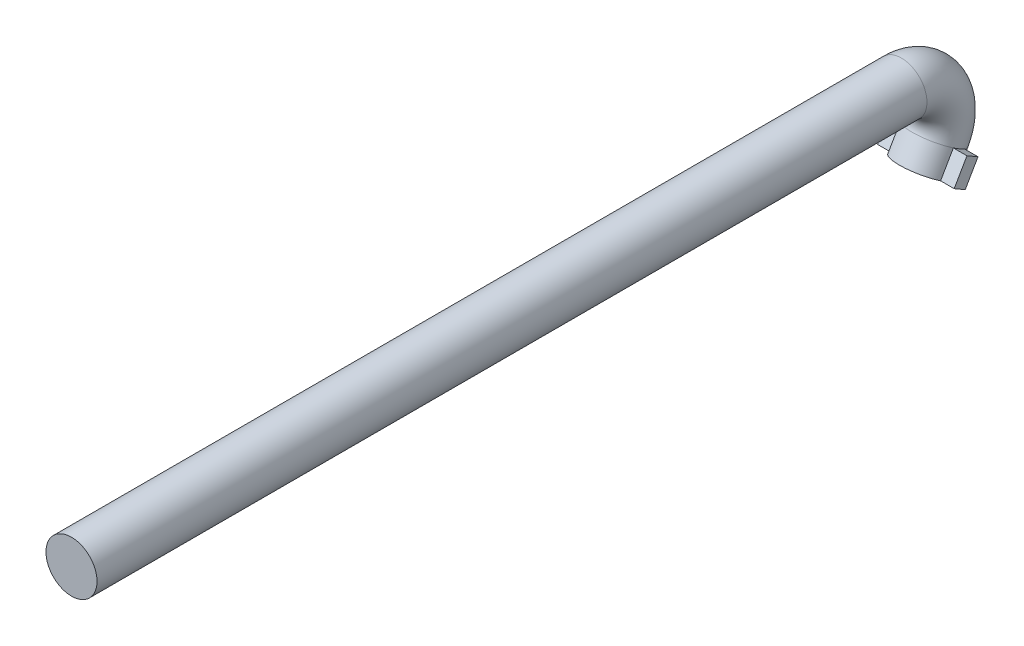
ISO-10303-21;
HEADER;
FILE_DESCRIPTION(('STEP AP214'),'2;1');
FILE_NAME('part.step','',(''),(''),'','','');
FILE_SCHEMA(('AUTOMOTIVE_DESIGN { 1 0 10303 214 1 1 1 1 }'));
ENDSEC;
DATA;
#1=APPLICATION_CONTEXT('core data for automotive mechanical design processes');
#2=APPLICATION_PROTOCOL_DEFINITION('international standard','automotive_design',2000,#1);
#3=PRODUCT_CONTEXT('',#1,'mechanical');
#4=PRODUCT('Part','Part','',(#3));
#5=PRODUCT_RELATED_PRODUCT_CATEGORY('part','',(#4));
#6=PRODUCT_DEFINITION_FORMATION('','',#4);
#7=PRODUCT_DEFINITION_CONTEXT('part definition',#1,'design');
#8=PRODUCT_DEFINITION('design','',#6,#7);
#9=PRODUCT_DEFINITION_SHAPE('','',#8);
#10=(LENGTH_UNIT() NAMED_UNIT(*) SI_UNIT(.MILLI.,.METRE.));
#11=(NAMED_UNIT(*) PLANE_ANGLE_UNIT() SI_UNIT($,.RADIAN.));
#12=(NAMED_UNIT(*) SI_UNIT($,.STERADIAN.) SOLID_ANGLE_UNIT());
#13=UNCERTAINTY_MEASURE_WITH_UNIT(LENGTH_MEASURE(1.E-05),#10,'distance_accuracy_value','');
#14=(GEOMETRIC_REPRESENTATION_CONTEXT(3) GLOBAL_UNCERTAINTY_ASSIGNED_CONTEXT((#13)) GLOBAL_UNIT_ASSIGNED_CONTEXT((#10,
#11,#12)) REPRESENTATION_CONTEXT('',''));
#15=CARTESIAN_POINT('',(0.,0.,0.));
#16=DIRECTION('',(0.,0.,1.));
#17=DIRECTION('',(1.,0.,0.));
#18=AXIS2_PLACEMENT_3D('',#15,#16,#17);
#19=CARTESIAN_POINT('',(0.,0.,65.));
#20=DIRECTION('',(0.,0.,-1.));
#21=DIRECTION('',(-1.,0.,0.));
#22=AXIS2_PLACEMENT_3D('',#19,#20,#21);
#23=CYLINDRICAL_SURFACE('',#22,2.);
#24=CARTESIAN_POINT('',(0.,0.,65.));
#25=DIRECTION('',(0.,0.,1.));
#26=DIRECTION('',(1.,0.,0.));
#27=AXIS2_PLACEMENT_3D('',#24,#25,#26);
#28=CIRCLE('',#27,2.);
#29=CARTESIAN_POINT('',(2.,0.,65.));
#30=VERTEX_POINT('',#29);
#31=EDGE_CURVE('E11',#30,#30,#28,.T.);
#32=ORIENTED_EDGE('',*,*,#31,.F.);
#33=EDGE_LOOP('',(#32));
#34=FACE_BOUND('',#33,.T.);
#35=CARTESIAN_POINT('',(0.,0.,0.));
#36=DIRECTION('',(0.,0.,1.));
#37=DIRECTION('',(1.,0.,0.));
#38=AXIS2_PLACEMENT_3D('',#35,#36,#37);
#39=CIRCLE('',#38,2.);
#40=CARTESIAN_POINT('',(2.,0.,0.));
#41=VERTEX_POINT('',#40);
#42=EDGE_CURVE('E35',#41,#41,#39,.T.);
#43=ORIENTED_EDGE('',*,*,#42,.T.);
#44=EDGE_LOOP('',(#43));
#45=FACE_BOUND('',#44,.T.);
#46=ADVANCED_FACE('F32',(#34,#45),#23,.T.);
#47=CARTESIAN_POINT('',(0.,0.,65.));
#48=DIRECTION('',(0.,0.,1.));
#49=DIRECTION('',(1.,0.,0.));
#50=AXIS2_PLACEMENT_3D('',#47,#48,#49);
#51=PLANE('',#50);
#52=ORIENTED_EDGE('',*,*,#31,.T.);
#53=EDGE_LOOP('',(#52));
#54=FACE_BOUND('',#53,.T.);
#55=ADVANCED_FACE('F189',(#54),#51,.T.);
#56=CARTESIAN_POINT('',(0.,-2.96402697240694,0.));
#57=DIRECTION('',(1.,0.,0.));
#58=DIRECTION('',(0.,0.,-1.));
#59=AXIS2_PLACEMENT_3D('',#56,#57,#58);
#60=TOROIDAL_SURFACE('',#59,2.96402697240694,2.);
#61=CARTESIAN_POINT('',(0.,-4.44604045861042,-2.56692265560668));
#62=DIRECTION('',(0.,-0.866025403784436,0.500000000000004));
#63=DIRECTION('',(-1.,0.,0.));
#64=AXIS2_PLACEMENT_3D('',#61,#62,#63);
#65=CIRCLE('',#64,2.);
#66=CARTESIAN_POINT('',(-1.93649167310371,-4.69604045861043,-2.9999353574989));
#67=VERTEX_POINT('',#66);
#68=CARTESIAN_POINT('',(1.93649167310371,-4.69604045861043,-2.9999353574989));
#69=VERTEX_POINT('',#68);
#70=EDGE_CURVE('E123',#67,#69,#65,.T.);
#71=ORIENTED_EDGE('',*,*,#70,.F.);
#72=CARTESIAN_POINT('',(-1.93649167310371,-4.19604045861042,-2.13390995371446));
#73=VERTEX_POINT('',#72);
#74=EDGE_CURVE('E119',#73,#67,#65,.T.);
#75=ORIENTED_EDGE('',*,*,#74,.F.);
#76=CARTESIAN_POINT('',(0.,-4.44604045861043,-2.56692265560668));
#77=DIRECTION('',(0.,-0.866025403784436,0.500000000000004));
#78=DIRECTION('',(0.,-0.500000000000004,-0.866025403784436));
#79=AXIS2_PLACEMENT_3D('',#76,#77,#78);
#80=CIRCLE('',#79,2.);
#81=CARTESIAN_POINT('',(1.93649167310371,-4.19604045861042,-2.13390995371446));
#82=VERTEX_POINT('',#81);
#83=EDGE_CURVE('E46',#82,#73,#80,.T.);
#84=ORIENTED_EDGE('',*,*,#83,.F.);
#85=EDGE_CURVE('E50',#69,#82,#65,.T.);
#86=ORIENTED_EDGE('',*,*,#85,.F.);
#87=EDGE_LOOP('',(#71,#75,#84,#86));
#88=FACE_BOUND('',#87,.T.);
#89=ORIENTED_EDGE('',*,*,#42,.F.);
#90=EDGE_LOOP('',(#89));
#91=FACE_BOUND('',#90,.T.);
#92=ADVANCED_FACE('F186',(#88,#91),#60,.T.);
#93=CARTESIAN_POINT('',(0.,-4.44604045861043,-2.56692265560668));
#94=DIRECTION('',(0.,-0.866025403784436,0.500000000000004));
#95=DIRECTION('',(0.,-0.500000000000004,-0.866025403784436));
#96=AXIS2_PLACEMENT_3D('',#93,#94,#95);
#97=PLANE('',#96);
#98=DIRECTION('',(1.,0.,0.));
#99=VECTOR('',#98,1.);
#100=CARTESIAN_POINT('',(2.,-4.69604045861043,-2.9999353574989));
#101=LINE('',#100,#99);
#102=CARTESIAN_POINT('',(3.,-4.69604045861043,-2.9999353574989));
#103=VERTEX_POINT('',#102);
#104=EDGE_CURVE('E134',#69,#103,#101,.T.);
#105=ORIENTED_EDGE('',*,*,#104,.F.);
#106=ORIENTED_EDGE('',*,*,#85,.T.);
#107=DIRECTION('',(-1.,0.,0.));
#108=VECTOR('',#107,1.);
#109=CARTESIAN_POINT('',(2.,-4.19604045861042,-2.13390995371446));
#110=LINE('',#109,#108);
#111=CARTESIAN_POINT('',(3.,-4.19604045861042,-2.13390995371446));
#112=VERTEX_POINT('',#111);
#113=EDGE_CURVE('E132',#112,#82,#110,.T.);
#114=ORIENTED_EDGE('',*,*,#113,.F.);
#115=DIRECTION('',(0.,0.500000000000004,0.866025403784436));
#116=VECTOR('',#115,1.);
#117=CARTESIAN_POINT('',(3.,-4.69604045861043,-2.9999353574989));
#118=LINE('',#117,#116);
#119=EDGE_CURVE('E145',#103,#112,#118,.T.);
#120=ORIENTED_EDGE('',*,*,#119,.F.);
#121=EDGE_LOOP('',(#105,#106,#114,#120));
#122=FACE_BOUND('',#121,.T.);
#123=ADVANCED_FACE('F130',(#122),#97,.F.);
#124=DIRECTION('',(-1.,0.,0.));
#125=VECTOR('',#124,1.);
#126=CARTESIAN_POINT('',(-2.,-4.19604045861042,-2.13390995371446));
#127=LINE('',#126,#125);
#128=CARTESIAN_POINT('',(-3.,-4.19604045861042,-2.13390995371446));
#129=VERTEX_POINT('',#128);
#130=EDGE_CURVE('E170',#73,#129,#127,.T.);
#131=ORIENTED_EDGE('',*,*,#130,.F.);
#132=ORIENTED_EDGE('',*,*,#74,.T.);
#133=DIRECTION('',(1.,0.,0.));
#134=VECTOR('',#133,1.);
#135=CARTESIAN_POINT('',(-2.,-4.69604045861043,-2.9999353574989));
#136=LINE('',#135,#134);
#137=CARTESIAN_POINT('',(-3.,-4.69604045861043,-2.9999353574989));
#138=VERTEX_POINT('',#137);
#139=EDGE_CURVE('E114',#138,#67,#136,.T.);
#140=ORIENTED_EDGE('',*,*,#139,.F.);
#141=DIRECTION('',(0.,-0.500000000000004,-0.866025403784436));
#142=VECTOR('',#141,1.);
#143=CARTESIAN_POINT('',(-3.,-4.69604045861043,-2.9999353574989));
#144=LINE('',#143,#142);
#145=EDGE_CURVE('E172',#129,#138,#144,.T.);
#146=ORIENTED_EDGE('',*,*,#145,.F.);
#147=EDGE_LOOP('',(#131,#132,#140,#146));
#148=FACE_BOUND('',#147,.T.);
#149=ADVANCED_FACE('F185',(#148),#97,.F.);
#150=CARTESIAN_POINT('',(0.,-6.1780912661793,-1.56692265560667));
#151=DIRECTION('',(0.,0.866025403784436,-0.500000000000004));
#152=DIRECTION('',(0.,0.500000000000004,0.866025403784436));
#153=AXIS2_PLACEMENT_3D('',#150,#151,#152);
#154=CYLINDRICAL_SURFACE('',#153,2.);
#155=ORIENTED_EDGE('',*,*,#70,.T.);
#156=DIRECTION('',(0.,0.866025403784436,-0.500000000000004));
#157=VECTOR('',#156,1.);
#158=CARTESIAN_POINT('',(1.93649167310371,-6.4280912661793,-1.99993535749889));
#159=LINE('',#158,#157);
#160=CARTESIAN_POINT('',(1.93649167310371,-6.4280912661793,-1.99993535749889));
#161=VERTEX_POINT('',#160);
#162=EDGE_CURVE('E101',#161,#69,#159,.T.);
#163=ORIENTED_EDGE('',*,*,#162,.F.);
#164=CARTESIAN_POINT('',(0.,-6.1780912661793,-1.56692265560667));
#165=DIRECTION('',(0.,-0.866025403784436,0.500000000000004));
#166=DIRECTION('',(0.,-0.500000000000004,-0.866025403784436));
#167=AXIS2_PLACEMENT_3D('',#164,#165,#166);
#168=CIRCLE('',#167,2.);
#169=CARTESIAN_POINT('',(-1.93649167310371,-6.4280912661793,-1.99993535749889));
#170=VERTEX_POINT('',#169);
#171=EDGE_CURVE('E94',#170,#161,#168,.T.);
#172=ORIENTED_EDGE('',*,*,#171,.F.);
#173=DIRECTION('',(0.,0.866025403784436,-0.500000000000004));
#174=VECTOR('',#173,1.);
#175=CARTESIAN_POINT('',(-1.93649167310371,-6.4280912661793,-1.99993535749889));
#176=LINE('',#175,#174);
#177=EDGE_CURVE('E99',#170,#67,#176,.T.);
#178=ORIENTED_EDGE('',*,*,#177,.T.);
#179=EDGE_LOOP('',(#155,#163,#172,#178));
#180=FACE_BOUND('',#179,.T.);
#181=ADVANCED_FACE('F97',(#180),#154,.T.);
#182=CARTESIAN_POINT('',(2.,-6.4280912661793,-1.99993535749889));
#183=DIRECTION('',(0.,0.500000000000004,0.866025403784436));
#184=DIRECTION('',(0.,-0.866025403784436,0.500000000000004));
#185=AXIS2_PLACEMENT_3D('',#182,#183,#184);
#186=PLANE('',#185);
#187=ORIENTED_EDGE('',*,*,#104,.T.);
#188=DIRECTION('',(0.,0.866025403784436,-0.500000000000004));
#189=VECTOR('',#188,1.);
#190=CARTESIAN_POINT('',(3.,-6.4280912661793,-1.99993535749889));
#191=LINE('',#190,#189);
#192=CARTESIAN_POINT('',(3.,-6.4280912661793,-1.99993535749889));
#193=VERTEX_POINT('',#192);
#194=EDGE_CURVE('E124',#193,#103,#191,.T.);
#195=ORIENTED_EDGE('',*,*,#194,.F.);
#196=DIRECTION('',(1.,0.,0.));
#197=VECTOR('',#196,1.);
#198=CARTESIAN_POINT('',(2.,-6.4280912661793,-1.99993535749889));
#199=LINE('',#198,#197);
#200=EDGE_CURVE('E104',#161,#193,#199,.T.);
#201=ORIENTED_EDGE('',*,*,#200,.F.);
#202=ORIENTED_EDGE('',*,*,#162,.T.);
#203=EDGE_LOOP('',(#187,#195,#201,#202));
#204=FACE_BOUND('',#203,.T.);
#205=ADVANCED_FACE('F205',(#204),#186,.F.);
#206=CARTESIAN_POINT('',(3.,-6.4280912661793,-1.99993535749889));
#207=DIRECTION('',(-1.,0.,0.));
#208=DIRECTION('',(0.,0.,1.));
#209=AXIS2_PLACEMENT_3D('',#206,#207,#208);
#210=PLANE('',#209);
#211=ORIENTED_EDGE('',*,*,#119,.T.);
#212=DIRECTION('',(0.,0.866025403784436,-0.500000000000004));
#213=VECTOR('',#212,1.);
#214=CARTESIAN_POINT('',(3.,-5.9280912661793,-1.13390995371445));
#215=LINE('',#214,#213);
#216=CARTESIAN_POINT('',(3.,-5.9280912661793,-1.13390995371445));
#217=VERTEX_POINT('',#216);
#218=EDGE_CURVE('E144',#217,#112,#215,.T.);
#219=ORIENTED_EDGE('',*,*,#218,.F.);
#220=DIRECTION('',(0.,0.500000000000004,0.866025403784436));
#221=VECTOR('',#220,1.);
#222=CARTESIAN_POINT('',(3.,-6.4280912661793,-1.99993535749889));
#223=LINE('',#222,#221);
#224=EDGE_CURVE('E163',#193,#217,#223,.T.);
#225=ORIENTED_EDGE('',*,*,#224,.F.);
#226=ORIENTED_EDGE('',*,*,#194,.T.);
#227=EDGE_LOOP('',(#211,#219,#225,#226));
#228=FACE_BOUND('',#227,.T.);
#229=ADVANCED_FACE('F162',(#228),#210,.F.);
#230=CARTESIAN_POINT('',(2.,-5.9280912661793,-1.13390995371445));
#231=DIRECTION('',(0.,-0.500000000000004,-0.866025403784436));
#232=DIRECTION('',(0.,0.866025403784436,-0.500000000000004));
#233=AXIS2_PLACEMENT_3D('',#230,#231,#232);
#234=PLANE('',#233);
#235=ORIENTED_EDGE('',*,*,#113,.T.);
#236=DIRECTION('',(0.,0.866025403784436,-0.500000000000004));
#237=VECTOR('',#236,1.);
#238=CARTESIAN_POINT('',(1.93649167310371,-5.9280912661793,-1.13390995371445));
#239=LINE('',#238,#237);
#240=CARTESIAN_POINT('',(1.93649167310371,-5.9280912661793,-1.13390995371445));
#241=VERTEX_POINT('',#240);
#242=EDGE_CURVE('E141',#241,#82,#239,.T.);
#243=ORIENTED_EDGE('',*,*,#242,.F.);
#244=DIRECTION('',(-1.,0.,0.));
#245=VECTOR('',#244,1.);
#246=CARTESIAN_POINT('',(2.,-5.9280912661793,-1.13390995371445));
#247=LINE('',#246,#245);
#248=EDGE_CURVE('E319',#217,#241,#247,.T.);
#249=ORIENTED_EDGE('',*,*,#248,.F.);
#250=ORIENTED_EDGE('',*,*,#218,.T.);
#251=EDGE_LOOP('',(#235,#243,#249,#250));
#252=FACE_BOUND('',#251,.T.);
#253=ADVANCED_FACE('F139',(#252),#234,.F.);
#254=CARTESIAN_POINT('',(0.,-6.1780912661793,-1.56692265560667));
#255=DIRECTION('',(0.,0.866025403784436,-0.500000000000004));
#256=DIRECTION('',(0.,0.500000000000004,0.866025403784436));
#257=AXIS2_PLACEMENT_3D('',#254,#255,#256);
#258=CYLINDRICAL_SURFACE('',#257,2.);
#259=ORIENTED_EDGE('',*,*,#83,.T.);
#260=DIRECTION('',(0.,0.866025403784436,-0.500000000000004));
#261=VECTOR('',#260,1.);
#262=CARTESIAN_POINT('',(-1.93649167310371,-5.9280912661793,-1.13390995371445));
#263=LINE('',#262,#261);
#264=CARTESIAN_POINT('',(-1.93649167310371,-5.9280912661793,-1.13390995371445));
#265=VERTEX_POINT('',#264);
#266=EDGE_CURVE('E152',#265,#73,#263,.T.);
#267=ORIENTED_EDGE('',*,*,#266,.F.);
#268=CARTESIAN_POINT('',(0.,-6.1780912661793,-1.56692265560667));
#269=DIRECTION('',(0.,-0.866025403784436,0.500000000000004));
#270=DIRECTION('',(0.,-0.500000000000004,-0.866025403784436));
#271=AXIS2_PLACEMENT_3D('',#268,#269,#270);
#272=CIRCLE('',#271,2.);
#273=EDGE_CURVE('E151',#241,#265,#272,.T.);
#274=ORIENTED_EDGE('',*,*,#273,.F.);
#275=ORIENTED_EDGE('',*,*,#242,.T.);
#276=EDGE_LOOP('',(#259,#267,#274,#275));
#277=FACE_BOUND('',#276,.T.);
#278=ADVANCED_FACE('F148',(#277),#258,.T.);
#279=CARTESIAN_POINT('',(-2.,-5.9280912661793,-1.13390995371445));
#280=DIRECTION('',(0.,-0.500000000000004,-0.866025403784436));
#281=DIRECTION('',(0.,0.866025403784436,-0.500000000000004));
#282=AXIS2_PLACEMENT_3D('',#279,#280,#281);
#283=PLANE('',#282);
#284=ORIENTED_EDGE('',*,*,#130,.T.);
#285=DIRECTION('',(0.,0.866025403784436,-0.500000000000004));
#286=VECTOR('',#285,1.);
#287=CARTESIAN_POINT('',(-3.,-5.9280912661793,-1.13390995371445));
#288=LINE('',#287,#286);
#289=CARTESIAN_POINT('',(-3.,-5.9280912661793,-1.13390995371445));
#290=VERTEX_POINT('',#289);
#291=EDGE_CURVE('E155',#290,#129,#288,.T.);
#292=ORIENTED_EDGE('',*,*,#291,.F.);
#293=DIRECTION('',(-1.,0.,0.));
#294=VECTOR('',#293,1.);
#295=CARTESIAN_POINT('',(-2.,-5.9280912661793,-1.13390995371445));
#296=LINE('',#295,#294);
#297=EDGE_CURVE('E317',#265,#290,#296,.T.);
#298=ORIENTED_EDGE('',*,*,#297,.F.);
#299=ORIENTED_EDGE('',*,*,#266,.T.);
#300=EDGE_LOOP('',(#284,#292,#298,#299));
#301=FACE_BOUND('',#300,.T.);
#302=ADVANCED_FACE('F214',(#301),#283,.F.);
#303=CARTESIAN_POINT('',(-3.,-6.4280912661793,-1.99993535749889));
#304=DIRECTION('',(1.,0.,0.));
#305=DIRECTION('',(0.,0.,-1.));
#306=AXIS2_PLACEMENT_3D('',#303,#304,#305);
#307=PLANE('',#306);
#308=ORIENTED_EDGE('',*,*,#145,.T.);
#309=DIRECTION('',(0.,0.866025403784436,-0.500000000000004));
#310=VECTOR('',#309,1.);
#311=CARTESIAN_POINT('',(-3.,-6.4280912661793,-1.99993535749889));
#312=LINE('',#311,#310);
#313=CARTESIAN_POINT('',(-3.,-6.4280912661793,-1.99993535749889));
#314=VERTEX_POINT('',#313);
#315=EDGE_CURVE('E175',#314,#138,#312,.T.);
#316=ORIENTED_EDGE('',*,*,#315,.F.);
#317=DIRECTION('',(0.,-0.500000000000004,-0.866025403784436));
#318=VECTOR('',#317,1.);
#319=CARTESIAN_POINT('',(-3.,-6.4280912661793,-1.99993535749889));
#320=LINE('',#319,#318);
#321=EDGE_CURVE('E110',#290,#314,#320,.T.);
#322=ORIENTED_EDGE('',*,*,#321,.F.);
#323=ORIENTED_EDGE('',*,*,#291,.T.);
#324=EDGE_LOOP('',(#308,#316,#322,#323));
#325=FACE_BOUND('',#324,.T.);
#326=ADVANCED_FACE('F180',(#325),#307,.F.);
#327=CARTESIAN_POINT('',(-2.,-6.4280912661793,-1.99993535749889));
#328=DIRECTION('',(0.,0.500000000000004,0.866025403784436));
#329=DIRECTION('',(0.,-0.866025403784436,0.500000000000004));
#330=AXIS2_PLACEMENT_3D('',#327,#328,#329);
#331=PLANE('',#330);
#332=ORIENTED_EDGE('',*,*,#139,.T.);
#333=ORIENTED_EDGE('',*,*,#177,.F.);
#334=DIRECTION('',(1.,0.,0.));
#335=VECTOR('',#334,1.);
#336=CARTESIAN_POINT('',(-2.,-6.4280912661793,-1.99993535749889));
#337=LINE('',#336,#335);
#338=EDGE_CURVE('E105',#314,#170,#337,.T.);
#339=ORIENTED_EDGE('',*,*,#338,.F.);
#340=ORIENTED_EDGE('',*,*,#315,.T.);
#341=EDGE_LOOP('',(#332,#333,#339,#340));
#342=FACE_BOUND('',#341,.T.);
#343=ADVANCED_FACE('F117',(#342),#331,.F.);
#344=CARTESIAN_POINT('',(0.,-6.1780912661793,-1.56692265560667));
#345=DIRECTION('',(0.,-0.866025403784436,0.500000000000004));
#346=DIRECTION('',(0.,-0.500000000000004,-0.866025403784436));
#347=AXIS2_PLACEMENT_3D('',#344,#345,#346);
#348=PLANE('',#347);
#349=ORIENTED_EDGE('',*,*,#338,.T.);
#350=ORIENTED_EDGE('',*,*,#171,.T.);
#351=ORIENTED_EDGE('',*,*,#200,.T.);
#352=ORIENTED_EDGE('',*,*,#224,.T.);
#353=ORIENTED_EDGE('',*,*,#248,.T.);
#354=ORIENTED_EDGE('',*,*,#273,.T.);
#355=ORIENTED_EDGE('',*,*,#297,.T.);
#356=ORIENTED_EDGE('',*,*,#321,.T.);
#357=EDGE_LOOP('',(#349,#350,#351,#352,#353,#354,#355,#356));
#358=FACE_BOUND('',#357,.T.);
#359=ADVANCED_FACE('F108',(#358),#348,.T.);
#360=CLOSED_SHELL('',(#46,#55,#92,#123,#149,#181,#205,#229,#253,#278,#302,#326,#343,#359));
#361=MANIFOLD_SOLID_BREP('B2',#360);
#362=ADVANCED_BREP_SHAPE_REPRESENTATION('',(#18,#361),#14);
#363=SHAPE_DEFINITION_REPRESENTATION(#9,#362);
ENDSEC;
END-ISO-10303-21;
